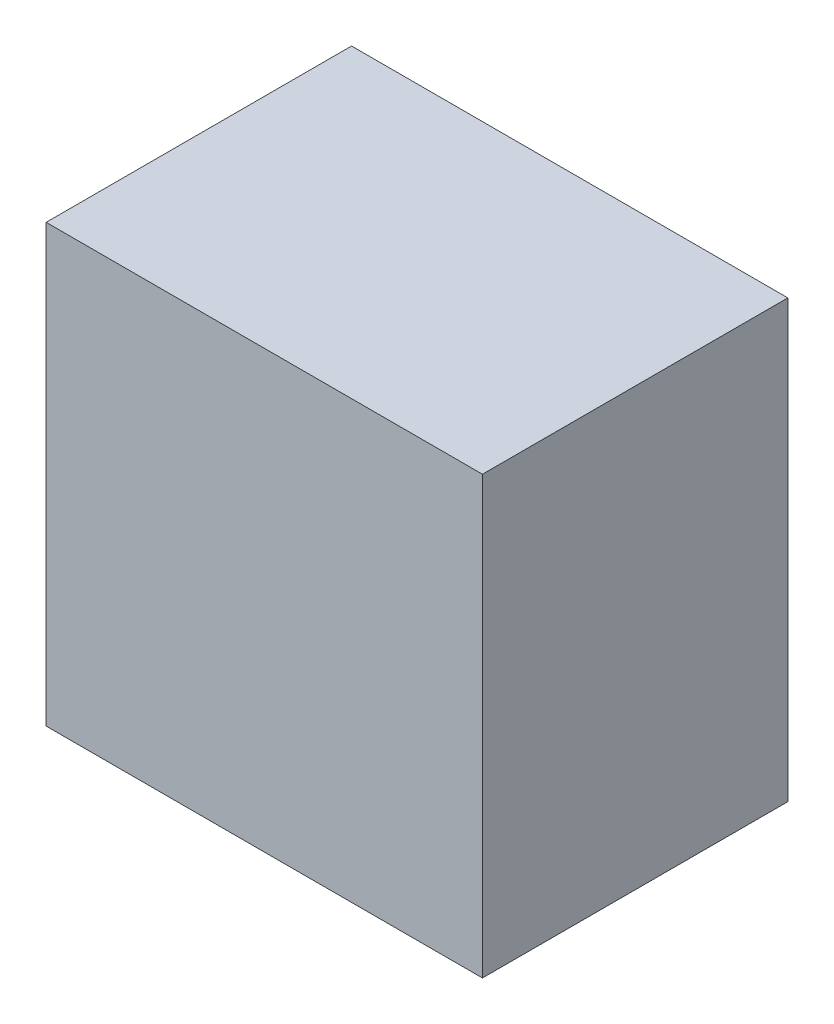
ISO-10303-21;
HEADER;
FILE_DESCRIPTION(('STEP AP214'),'2;1');
FILE_NAME('part.step','',(''),(''),'','','');
FILE_SCHEMA(('AUTOMOTIVE_DESIGN { 1 0 10303 214 1 1 1 1 }'));
ENDSEC;
DATA;
#1=APPLICATION_CONTEXT('core data for automotive mechanical design processes');
#2=APPLICATION_PROTOCOL_DEFINITION('international standard','automotive_design',2000,#1);
#3=PRODUCT_CONTEXT('',#1,'mechanical');
#4=PRODUCT('Part','Part','',(#3));
#5=PRODUCT_RELATED_PRODUCT_CATEGORY('part','',(#4));
#6=PRODUCT_DEFINITION_FORMATION('','',#4);
#7=PRODUCT_DEFINITION_CONTEXT('part definition',#1,'design');
#8=PRODUCT_DEFINITION('design','',#6,#7);
#9=PRODUCT_DEFINITION_SHAPE('','',#8);
#10=(LENGTH_UNIT() NAMED_UNIT(*) SI_UNIT(.MILLI.,.METRE.));
#11=(NAMED_UNIT(*) PLANE_ANGLE_UNIT() SI_UNIT($,.RADIAN.));
#12=(NAMED_UNIT(*) SI_UNIT($,.STERADIAN.) SOLID_ANGLE_UNIT());
#13=UNCERTAINTY_MEASURE_WITH_UNIT(LENGTH_MEASURE(1.E-05),#10,'distance_accuracy_value','');
#14=(GEOMETRIC_REPRESENTATION_CONTEXT(3) GLOBAL_UNCERTAINTY_ASSIGNED_CONTEXT((#13)) GLOBAL_UNIT_ASSIGNED_CONTEXT((#10,
#11,#12)) REPRESENTATION_CONTEXT('',''));
#15=CARTESIAN_POINT('',(0.,0.,0.));
#16=DIRECTION('',(0.,0.,1.));
#17=DIRECTION('',(1.,0.,0.));
#18=AXIS2_PLACEMENT_3D('',#15,#16,#17);
#19=CARTESIAN_POINT('',(5.,-5.,7.));
#20=DIRECTION('',(-1.,0.,0.));
#21=DIRECTION('',(0.,0.,1.));
#22=AXIS2_PLACEMENT_3D('',#19,#20,#21);
#23=PLANE('',#22);
#24=DIRECTION('',(0.,1.,0.));
#25=VECTOR('',#24,1.);
#26=CARTESIAN_POINT('',(5.,-5.,0.));
#27=LINE('',#26,#25);
#28=CARTESIAN_POINT('',(5.,-5.,0.));
#29=VERTEX_POINT('',#28);
#30=CARTESIAN_POINT('',(5.,5.,0.));
#31=VERTEX_POINT('',#30);
#32=EDGE_CURVE('E104',#29,#31,#27,.T.);
#33=ORIENTED_EDGE('',*,*,#32,.T.);
#34=DIRECTION('',(0.,0.,-1.));
#35=VECTOR('',#34,1.);
#36=CARTESIAN_POINT('',(5.,5.,7.));
#37=LINE('',#36,#35);
#38=CARTESIAN_POINT('',(5.,5.,7.));
#39=VERTEX_POINT('',#38);
#40=EDGE_CURVE('E11',#39,#31,#37,.T.);
#41=ORIENTED_EDGE('',*,*,#40,.F.);
#42=DIRECTION('',(0.,1.,0.));
#43=VECTOR('',#42,1.);
#44=CARTESIAN_POINT('',(5.,-5.,7.));
#45=LINE('',#44,#43);
#46=CARTESIAN_POINT('',(5.,-5.,7.));
#47=VERTEX_POINT('',#46);
#48=EDGE_CURVE('E92',#47,#39,#45,.T.);
#49=ORIENTED_EDGE('',*,*,#48,.F.);
#50=DIRECTION('',(0.,0.,-1.));
#51=VECTOR('',#50,1.);
#52=CARTESIAN_POINT('',(5.,-5.,7.));
#53=LINE('',#52,#51);
#54=EDGE_CURVE('E100',#47,#29,#53,.T.);
#55=ORIENTED_EDGE('',*,*,#54,.T.);
#56=EDGE_LOOP('',(#33,#41,#49,#55));
#57=FACE_BOUND('',#56,.T.);
#58=ADVANCED_FACE('F41',(#57),#23,.F.);
#59=CARTESIAN_POINT('',(-5.,5.,7.));
#60=DIRECTION('',(0.,-1.,0.));
#61=DIRECTION('',(0.,0.,-1.));
#62=AXIS2_PLACEMENT_3D('',#59,#60,#61);
#63=PLANE('',#62);
#64=DIRECTION('',(-1.,0.,0.));
#65=VECTOR('',#64,1.);
#66=CARTESIAN_POINT('',(-5.,5.,0.));
#67=LINE('',#66,#65);
#68=CARTESIAN_POINT('',(-5.,5.,0.));
#69=VERTEX_POINT('',#68);
#70=EDGE_CURVE('E96',#31,#69,#67,.T.);
#71=ORIENTED_EDGE('',*,*,#70,.T.);
#72=DIRECTION('',(0.,0.,-1.));
#73=VECTOR('',#72,1.);
#74=CARTESIAN_POINT('',(-5.,5.,7.));
#75=LINE('',#74,#73);
#76=CARTESIAN_POINT('',(-5.,5.,7.));
#77=VERTEX_POINT('',#76);
#78=EDGE_CURVE('E49',#77,#69,#75,.T.);
#79=ORIENTED_EDGE('',*,*,#78,.F.);
#80=DIRECTION('',(-1.,0.,0.));
#81=VECTOR('',#80,1.);
#82=CARTESIAN_POINT('',(-5.,5.,7.));
#83=LINE('',#82,#81);
#84=EDGE_CURVE('E87',#39,#77,#83,.T.);
#85=ORIENTED_EDGE('',*,*,#84,.F.);
#86=ORIENTED_EDGE('',*,*,#40,.T.);
#87=EDGE_LOOP('',(#71,#79,#85,#86));
#88=FACE_BOUND('',#87,.T.);
#89=ADVANCED_FACE('F95',(#88),#63,.F.);
#90=CARTESIAN_POINT('',(-5.,-5.,7.));
#91=DIRECTION('',(1.,0.,0.));
#92=DIRECTION('',(0.,0.,-1.));
#93=AXIS2_PLACEMENT_3D('',#90,#91,#92);
#94=PLANE('',#93);
#95=DIRECTION('',(0.,-1.,0.));
#96=VECTOR('',#95,1.);
#97=CARTESIAN_POINT('',(-5.,-5.,0.));
#98=LINE('',#97,#96);
#99=CARTESIAN_POINT('',(-5.,-5.,0.));
#100=VERTEX_POINT('',#99);
#101=EDGE_CURVE('E74',#69,#100,#98,.T.);
#102=ORIENTED_EDGE('',*,*,#101,.T.);
#103=DIRECTION('',(0.,0.,-1.));
#104=VECTOR('',#103,1.);
#105=CARTESIAN_POINT('',(-5.,-5.,7.));
#106=LINE('',#105,#104);
#107=CARTESIAN_POINT('',(-5.,-5.,7.));
#108=VERTEX_POINT('',#107);
#109=EDGE_CURVE('E97',#108,#100,#106,.T.);
#110=ORIENTED_EDGE('',*,*,#109,.F.);
#111=DIRECTION('',(0.,-1.,0.));
#112=VECTOR('',#111,1.);
#113=CARTESIAN_POINT('',(-5.,-5.,7.));
#114=LINE('',#113,#112);
#115=EDGE_CURVE('E90',#77,#108,#114,.T.);
#116=ORIENTED_EDGE('',*,*,#115,.F.);
#117=ORIENTED_EDGE('',*,*,#78,.T.);
#118=EDGE_LOOP('',(#102,#110,#116,#117));
#119=FACE_BOUND('',#118,.T.);
#120=ADVANCED_FACE('F98',(#119),#94,.F.);
#121=CARTESIAN_POINT('',(-5.,-5.,7.));
#122=DIRECTION('',(0.,1.,0.));
#123=DIRECTION('',(0.,0.,1.));
#124=AXIS2_PLACEMENT_3D('',#121,#122,#123);
#125=PLANE('',#124);
#126=DIRECTION('',(1.,0.,0.));
#127=VECTOR('',#126,1.);
#128=CARTESIAN_POINT('',(-5.,-5.,0.));
#129=LINE('',#128,#127);
#130=EDGE_CURVE('E80',#100,#29,#129,.T.);
#131=ORIENTED_EDGE('',*,*,#130,.T.);
#132=ORIENTED_EDGE('',*,*,#54,.F.);
#133=DIRECTION('',(1.,0.,0.));
#134=VECTOR('',#133,1.);
#135=CARTESIAN_POINT('',(-5.,-5.,7.));
#136=LINE('',#135,#134);
#137=EDGE_CURVE('E57',#108,#47,#136,.T.);
#138=ORIENTED_EDGE('',*,*,#137,.F.);
#139=ORIENTED_EDGE('',*,*,#109,.T.);
#140=EDGE_LOOP('',(#131,#132,#138,#139));
#141=FACE_BOUND('',#140,.T.);
#142=ADVANCED_FACE('F111',(#141),#125,.F.);
#143=CARTESIAN_POINT('',(0.,0.,7.));
#144=DIRECTION('',(0.,0.,-1.));
#145=DIRECTION('',(-1.,0.,0.));
#146=AXIS2_PLACEMENT_3D('',#143,#144,#145);
#147=PLANE('',#146);
#148=ORIENTED_EDGE('',*,*,#48,.T.);
#149=ORIENTED_EDGE('',*,*,#84,.T.);
#150=ORIENTED_EDGE('',*,*,#115,.T.);
#151=ORIENTED_EDGE('',*,*,#137,.T.);
#152=EDGE_LOOP('',(#148,#149,#150,#151));
#153=FACE_BOUND('',#152,.T.);
#154=ADVANCED_FACE('F88',(#153),#147,.F.);
#155=CARTESIAN_POINT('',(0.,0.,0.));
#156=DIRECTION('',(0.,0.,-1.));
#157=DIRECTION('',(-1.,0.,0.));
#158=AXIS2_PLACEMENT_3D('',#155,#156,#157);
#159=PLANE('',#158);
#160=ORIENTED_EDGE('',*,*,#32,.F.);
#161=ORIENTED_EDGE('',*,*,#130,.F.);
#162=ORIENTED_EDGE('',*,*,#101,.F.);
#163=ORIENTED_EDGE('',*,*,#70,.F.);
#164=EDGE_LOOP('',(#160,#161,#162,#163));
#165=FACE_BOUND('',#164,.T.);
#166=ADVANCED_FACE('F114',(#165),#159,.T.);
#167=CLOSED_SHELL('',(#58,#89,#120,#142,#154,#166));
#168=MANIFOLD_SOLID_BREP('B2',#167);
#169=ADVANCED_BREP_SHAPE_REPRESENTATION('',(#18,#168),#14);
#170=SHAPE_DEFINITION_REPRESENTATION(#9,#169);
ENDSEC;
END-ISO-10303-21;
